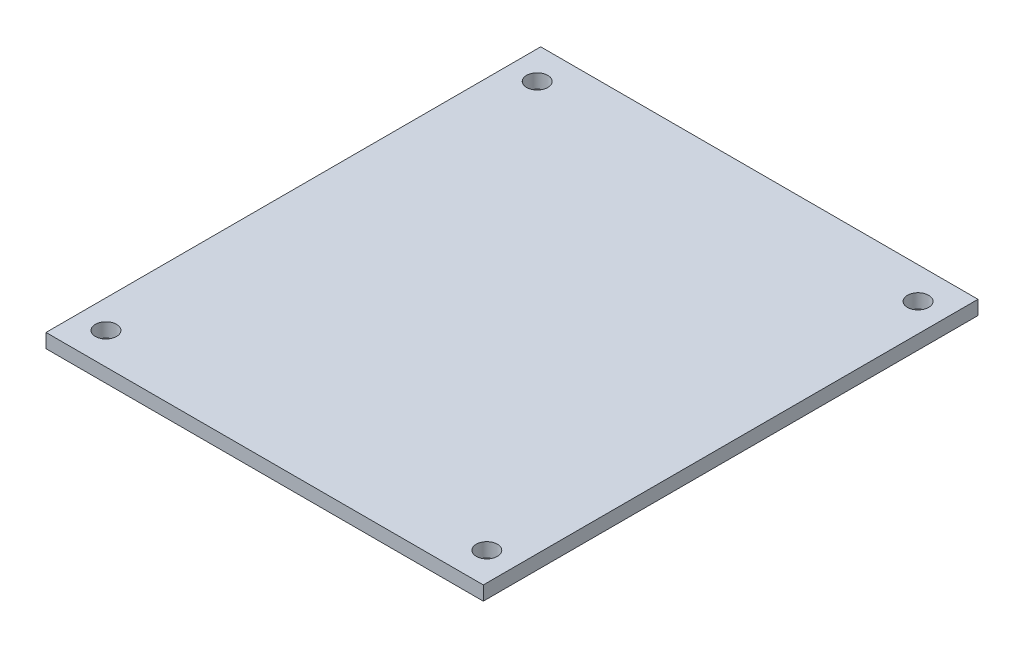
ISO-10303-21;
HEADER;
FILE_DESCRIPTION(('STEP AP214'),'2;1');
FILE_NAME('part.step','',(''),(''),'','','');
FILE_SCHEMA(('AUTOMOTIVE_DESIGN { 1 0 10303 214 1 1 1 1 }'));
ENDSEC;
DATA;
#1=APPLICATION_CONTEXT('core data for automotive mechanical design processes');
#2=APPLICATION_PROTOCOL_DEFINITION('international standard','automotive_design',2000,#1);
#3=PRODUCT_CONTEXT('',#1,'mechanical');
#4=PRODUCT('Part','Part','',(#3));
#5=PRODUCT_RELATED_PRODUCT_CATEGORY('part','',(#4));
#6=PRODUCT_DEFINITION_FORMATION('','',#4);
#7=PRODUCT_DEFINITION_CONTEXT('part definition',#1,'design');
#8=PRODUCT_DEFINITION('design','',#6,#7);
#9=PRODUCT_DEFINITION_SHAPE('','',#8);
#10=(LENGTH_UNIT() NAMED_UNIT(*) SI_UNIT(.MILLI.,.METRE.));
#11=(NAMED_UNIT(*) PLANE_ANGLE_UNIT() SI_UNIT($,.RADIAN.));
#12=(NAMED_UNIT(*) SI_UNIT($,.STERADIAN.) SOLID_ANGLE_UNIT());
#13=UNCERTAINTY_MEASURE_WITH_UNIT(LENGTH_MEASURE(1.E-05),#10,'distance_accuracy_value','');
#14=(GEOMETRIC_REPRESENTATION_CONTEXT(3) GLOBAL_UNCERTAINTY_ASSIGNED_CONTEXT((#13)) GLOBAL_UNIT_ASSIGNED_CONTEXT((#10,
#11,#12)) REPRESENTATION_CONTEXT('',''));
#15=CARTESIAN_POINT('',(0.,0.,0.));
#16=DIRECTION('',(0.,0.,1.));
#17=DIRECTION('',(1.,0.,0.));
#18=AXIS2_PLACEMENT_3D('',#15,#16,#17);
#19=CARTESIAN_POINT('',(0.,2.,0.));
#20=DIRECTION('',(0.,1.,0.));
#21=DIRECTION('',(0.,0.,1.));
#22=AXIS2_PLACEMENT_3D('',#19,#20,#21);
#23=PLANE('',#22);
#24=CARTESIAN_POINT('',(31.6545501334024,2.,17.8504431245316));
#25=DIRECTION('',(0.,1.,0.));
#26=DIRECTION('',(0.,0.,1.));
#27=AXIS2_PLACEMENT_3D('',#24,#25,#26);
#28=CIRCLE('',#27,1.5);
#29=CARTESIAN_POINT('',(31.6545501334024,2.,19.3504431245316));
#30=VERTEX_POINT('',#29);
#31=EDGE_CURVE('E123',#30,#30,#28,.T.);
#32=ORIENTED_EDGE('',*,*,#31,.F.);
#33=EDGE_LOOP('',(#32));
#34=FACE_BOUND('',#33,.T.);
#35=CARTESIAN_POINT('',(-22.3454498665976,2.,-43.2895568754684));
#36=DIRECTION('',(0.,1.,0.));
#37=DIRECTION('',(0.,0.,1.));
#38=AXIS2_PLACEMENT_3D('',#35,#36,#37);
#39=CIRCLE('',#38,1.5);
#40=CARTESIAN_POINT('',(-22.3454498665976,2.,-41.7895568754684));
#41=VERTEX_POINT('',#40);
#42=EDGE_CURVE('E102',#41,#41,#39,.T.);
#43=ORIENTED_EDGE('',*,*,#42,.F.);
#44=EDGE_LOOP('',(#43));
#45=FACE_BOUND('',#44,.T.);
#46=DIRECTION('',(0.,0.,1.));
#47=VECTOR('',#46,1.);
#48=CARTESIAN_POINT('',(-26.3454498665976,2.,-47.7895568754684));
#49=LINE('',#48,#47);
#50=CARTESIAN_POINT('',(-26.3454498665976,2.,-47.7895568754684));
#51=VERTEX_POINT('',#50);
#52=CARTESIAN_POINT('',(-26.3454498665976,2.,22.3504431245316));
#53=VERTEX_POINT('',#52);
#54=EDGE_CURVE('E87',#51,#53,#49,.T.);
#55=ORIENTED_EDGE('',*,*,#54,.T.);
#56=DIRECTION('',(1.,0.,0.));
#57=VECTOR('',#56,1.);
#58=CARTESIAN_POINT('',(-26.3454498665976,2.,22.3504431245316));
#59=LINE('',#58,#57);
#60=CARTESIAN_POINT('',(35.6545501334024,2.,22.3504431245316));
#61=VERTEX_POINT('',#60);
#62=EDGE_CURVE('E82',#53,#61,#59,.T.);
#63=ORIENTED_EDGE('',*,*,#62,.T.);
#64=DIRECTION('',(0.,0.,-1.));
#65=VECTOR('',#64,1.);
#66=CARTESIAN_POINT('',(35.6545501334024,2.,-47.7895568754684));
#67=LINE('',#66,#65);
#68=CARTESIAN_POINT('',(35.6545501334024,2.,-47.7895568754684));
#69=VERTEX_POINT('',#68);
#70=EDGE_CURVE('E85',#61,#69,#67,.T.);
#71=ORIENTED_EDGE('',*,*,#70,.T.);
#72=DIRECTION('',(-1.,0.,0.));
#73=VECTOR('',#72,1.);
#74=CARTESIAN_POINT('',(-26.3454498665976,2.,-47.7895568754684));
#75=LINE('',#74,#73);
#76=EDGE_CURVE('E52',#69,#51,#75,.T.);
#77=ORIENTED_EDGE('',*,*,#76,.T.);
#78=EDGE_LOOP('',(#55,#63,#71,#77));
#79=FACE_BOUND('',#78,.T.);
#80=CARTESIAN_POINT('',(31.6545501334024,2.,-43.2895568754684));
#81=DIRECTION('',(0.,1.,0.));
#82=DIRECTION('',(0.,0.,-1.));
#83=AXIS2_PLACEMENT_3D('',#80,#81,#82);
#84=CIRCLE('',#83,1.5);
#85=CARTESIAN_POINT('',(31.6545501334024,2.,-44.7895568754684));
#86=VERTEX_POINT('',#85);
#87=EDGE_CURVE('E117',#86,#86,#84,.T.);
#88=ORIENTED_EDGE('',*,*,#87,.F.);
#89=EDGE_LOOP('',(#88));
#90=FACE_BOUND('',#89,.T.);
#91=CARTESIAN_POINT('',(-22.3454498665976,2.,17.8504431245316));
#92=DIRECTION('',(0.,1.,0.));
#93=DIRECTION('',(0.,0.,-1.));
#94=AXIS2_PLACEMENT_3D('',#91,#92,#93);
#95=CIRCLE('',#94,1.5);
#96=CARTESIAN_POINT('',(-22.3454498665976,2.,16.3504431245316));
#97=VERTEX_POINT('',#96);
#98=EDGE_CURVE('E129',#97,#97,#95,.T.);
#99=ORIENTED_EDGE('',*,*,#98,.F.);
#100=EDGE_LOOP('',(#99));
#101=FACE_BOUND('',#100,.T.);
#102=ADVANCED_FACE('F35',(#34,#45,#79,#90,#101),#23,.T.);
#103=CARTESIAN_POINT('',(0.,0.,0.));
#104=DIRECTION('',(0.,1.,0.));
#105=DIRECTION('',(0.,0.,1.));
#106=AXIS2_PLACEMENT_3D('',#103,#104,#105);
#107=PLANE('',#106);
#108=DIRECTION('',(0.,0.,1.));
#109=VECTOR('',#108,1.);
#110=CARTESIAN_POINT('',(-26.3454498665976,0.,-47.7895568754684));
#111=LINE('',#110,#109);
#112=CARTESIAN_POINT('',(-26.3454498665976,0.,-47.7895568754684));
#113=VERTEX_POINT('',#112);
#114=CARTESIAN_POINT('',(-26.3454498665976,0.,22.3504431245316));
#115=VERTEX_POINT('',#114);
#116=EDGE_CURVE('E99',#113,#115,#111,.T.);
#117=ORIENTED_EDGE('',*,*,#116,.F.);
#118=DIRECTION('',(-1.,0.,0.));
#119=VECTOR('',#118,1.);
#120=CARTESIAN_POINT('',(-26.3454498665976,0.,-47.7895568754684));
#121=LINE('',#120,#119);
#122=CARTESIAN_POINT('',(35.6545501334024,0.,-47.7895568754684));
#123=VERTEX_POINT('',#122);
#124=EDGE_CURVE('E75',#123,#113,#121,.T.);
#125=ORIENTED_EDGE('',*,*,#124,.F.);
#126=DIRECTION('',(0.,0.,-1.));
#127=VECTOR('',#126,1.);
#128=CARTESIAN_POINT('',(35.6545501334024,0.,-47.7895568754684));
#129=LINE('',#128,#127);
#130=CARTESIAN_POINT('',(35.6545501334024,0.,22.3504431245316));
#131=VERTEX_POINT('',#130);
#132=EDGE_CURVE('E69',#131,#123,#129,.T.);
#133=ORIENTED_EDGE('',*,*,#132,.F.);
#134=DIRECTION('',(1.,0.,0.));
#135=VECTOR('',#134,1.);
#136=CARTESIAN_POINT('',(-26.3454498665976,0.,22.3504431245316));
#137=LINE('',#136,#135);
#138=EDGE_CURVE('E91',#115,#131,#137,.T.);
#139=ORIENTED_EDGE('',*,*,#138,.F.);
#140=EDGE_LOOP('',(#117,#125,#133,#139));
#141=FACE_BOUND('',#140,.T.);
#142=CARTESIAN_POINT('',(-22.3454498665976,0.,-43.2895568754684));
#143=DIRECTION('',(0.,1.,0.));
#144=DIRECTION('',(0.,0.,1.));
#145=AXIS2_PLACEMENT_3D('',#142,#143,#144);
#146=CIRCLE('',#145,1.5);
#147=CARTESIAN_POINT('',(-22.3454498665976,0.,-41.7895568754684));
#148=VERTEX_POINT('',#147);
#149=EDGE_CURVE('E114',#148,#148,#146,.T.);
#150=ORIENTED_EDGE('',*,*,#149,.T.);
#151=EDGE_LOOP('',(#150));
#152=FACE_BOUND('',#151,.T.);
#153=CARTESIAN_POINT('',(31.6545501334024,0.,-43.2895568754684));
#154=DIRECTION('',(0.,1.,0.));
#155=DIRECTION('',(0.,0.,-1.));
#156=AXIS2_PLACEMENT_3D('',#153,#154,#155);
#157=CIRCLE('',#156,1.5);
#158=CARTESIAN_POINT('',(31.6545501334024,0.,-44.7895568754684));
#159=VERTEX_POINT('',#158);
#160=EDGE_CURVE('E120',#159,#159,#157,.T.);
#161=ORIENTED_EDGE('',*,*,#160,.T.);
#162=EDGE_LOOP('',(#161));
#163=FACE_BOUND('',#162,.T.);
#164=CARTESIAN_POINT('',(31.6545501334024,0.,17.8504431245316));
#165=DIRECTION('',(0.,1.,0.));
#166=DIRECTION('',(0.,0.,1.));
#167=AXIS2_PLACEMENT_3D('',#164,#165,#166);
#168=CIRCLE('',#167,1.5);
#169=CARTESIAN_POINT('',(31.6545501334024,0.,19.3504431245316));
#170=VERTEX_POINT('',#169);
#171=EDGE_CURVE('E126',#170,#170,#168,.T.);
#172=ORIENTED_EDGE('',*,*,#171,.T.);
#173=EDGE_LOOP('',(#172));
#174=FACE_BOUND('',#173,.T.);
#175=CARTESIAN_POINT('',(-22.3454498665976,0.,17.8504431245316));
#176=DIRECTION('',(0.,1.,0.));
#177=DIRECTION('',(0.,0.,-1.));
#178=AXIS2_PLACEMENT_3D('',#175,#176,#177);
#179=CIRCLE('',#178,1.5);
#180=CARTESIAN_POINT('',(-22.3454498665976,0.,16.3504431245316));
#181=VERTEX_POINT('',#180);
#182=EDGE_CURVE('E132',#181,#181,#179,.T.);
#183=ORIENTED_EDGE('',*,*,#182,.T.);
#184=EDGE_LOOP('',(#183));
#185=FACE_BOUND('',#184,.T.);
#186=ADVANCED_FACE('F110',(#141,#152,#163,#174,#185),#107,.F.);
#187=CARTESIAN_POINT('',(-26.3454498665976,2.,-47.7895568754684));
#188=DIRECTION('',(1.,0.,0.));
#189=DIRECTION('',(0.,0.,-1.));
#190=AXIS2_PLACEMENT_3D('',#187,#188,#189);
#191=PLANE('',#190);
#192=ORIENTED_EDGE('',*,*,#116,.T.);
#193=DIRECTION('',(0.,-1.,0.));
#194=VECTOR('',#193,1.);
#195=CARTESIAN_POINT('',(-26.3454498665976,2.,22.3504431245316));
#196=LINE('',#195,#194);
#197=EDGE_CURVE('E11',#53,#115,#196,.T.);
#198=ORIENTED_EDGE('',*,*,#197,.F.);
#199=ORIENTED_EDGE('',*,*,#54,.F.);
#200=DIRECTION('',(0.,-1.,0.));
#201=VECTOR('',#200,1.);
#202=CARTESIAN_POINT('',(-26.3454498665976,2.,-47.7895568754684));
#203=LINE('',#202,#201);
#204=EDGE_CURVE('E95',#51,#113,#203,.T.);
#205=ORIENTED_EDGE('',*,*,#204,.T.);
#206=EDGE_LOOP('',(#192,#198,#199,#205));
#207=FACE_BOUND('',#206,.T.);
#208=ADVANCED_FACE('F37',(#207),#191,.F.);
#209=CARTESIAN_POINT('',(-26.3454498665976,2.,22.3504431245316));
#210=DIRECTION('',(0.,0.,-1.));
#211=DIRECTION('',(-1.,0.,0.));
#212=AXIS2_PLACEMENT_3D('',#209,#210,#211);
#213=PLANE('',#212);
#214=ORIENTED_EDGE('',*,*,#138,.T.);
#215=DIRECTION('',(0.,-1.,0.));
#216=VECTOR('',#215,1.);
#217=CARTESIAN_POINT('',(35.6545501334024,2.,22.3504431245316));
#218=LINE('',#217,#216);
#219=EDGE_CURVE('E44',#61,#131,#218,.T.);
#220=ORIENTED_EDGE('',*,*,#219,.F.);
#221=ORIENTED_EDGE('',*,*,#62,.F.);
#222=ORIENTED_EDGE('',*,*,#197,.T.);
#223=EDGE_LOOP('',(#214,#220,#221,#222));
#224=FACE_BOUND('',#223,.T.);
#225=ADVANCED_FACE('F90',(#224),#213,.F.);
#226=CARTESIAN_POINT('',(35.6545501334024,2.,-47.7895568754684));
#227=DIRECTION('',(-1.,0.,0.));
#228=DIRECTION('',(0.,0.,1.));
#229=AXIS2_PLACEMENT_3D('',#226,#227,#228);
#230=PLANE('',#229);
#231=ORIENTED_EDGE('',*,*,#132,.T.);
#232=DIRECTION('',(0.,-1.,0.));
#233=VECTOR('',#232,1.);
#234=CARTESIAN_POINT('',(35.6545501334024,2.,-47.7895568754684));
#235=LINE('',#234,#233);
#236=EDGE_CURVE('E92',#69,#123,#235,.T.);
#237=ORIENTED_EDGE('',*,*,#236,.F.);
#238=ORIENTED_EDGE('',*,*,#70,.F.);
#239=ORIENTED_EDGE('',*,*,#219,.T.);
#240=EDGE_LOOP('',(#231,#237,#238,#239));
#241=FACE_BOUND('',#240,.T.);
#242=ADVANCED_FACE('F93',(#241),#230,.F.);
#243=CARTESIAN_POINT('',(-26.3454498665976,2.,-47.7895568754684));
#244=DIRECTION('',(0.,0.,1.));
#245=DIRECTION('',(1.,0.,0.));
#246=AXIS2_PLACEMENT_3D('',#243,#244,#245);
#247=PLANE('',#246);
#248=ORIENTED_EDGE('',*,*,#124,.T.);
#249=ORIENTED_EDGE('',*,*,#204,.F.);
#250=ORIENTED_EDGE('',*,*,#76,.F.);
#251=ORIENTED_EDGE('',*,*,#236,.T.);
#252=EDGE_LOOP('',(#248,#249,#250,#251));
#253=FACE_BOUND('',#252,.T.);
#254=ADVANCED_FACE('F107',(#253),#247,.F.);
#255=CARTESIAN_POINT('',(-22.3454498665976,2.,-43.2895568754684));
#256=DIRECTION('',(0.,-1.,0.));
#257=DIRECTION('',(0.,0.,-1.));
#258=AXIS2_PLACEMENT_3D('',#255,#256,#257);
#259=CYLINDRICAL_SURFACE('',#258,1.5);
#260=ORIENTED_EDGE('',*,*,#42,.T.);
#261=EDGE_LOOP('',(#260));
#262=FACE_BOUND('',#261,.T.);
#263=ORIENTED_EDGE('',*,*,#149,.F.);
#264=EDGE_LOOP('',(#263));
#265=FACE_BOUND('',#264,.T.);
#266=ADVANCED_FACE('F151',(#262,#265),#259,.F.);
#267=CARTESIAN_POINT('',(31.6545501334024,2.,-43.2895568754684));
#268=DIRECTION('',(0.,-1.,0.));
#269=DIRECTION('',(0.,0.,-1.));
#270=AXIS2_PLACEMENT_3D('',#267,#268,#269);
#271=CYLINDRICAL_SURFACE('',#270,1.5);
#272=ORIENTED_EDGE('',*,*,#87,.T.);
#273=EDGE_LOOP('',(#272));
#274=FACE_BOUND('',#273,.T.);
#275=ORIENTED_EDGE('',*,*,#160,.F.);
#276=EDGE_LOOP('',(#275));
#277=FACE_BOUND('',#276,.T.);
#278=ADVANCED_FACE('F197',(#274,#277),#271,.F.);
#279=CARTESIAN_POINT('',(31.6545501334024,2.,17.8504431245316));
#280=DIRECTION('',(0.,-1.,0.));
#281=DIRECTION('',(0.,0.,-1.));
#282=AXIS2_PLACEMENT_3D('',#279,#280,#281);
#283=CYLINDRICAL_SURFACE('',#282,1.5);
#284=ORIENTED_EDGE('',*,*,#31,.T.);
#285=EDGE_LOOP('',(#284));
#286=FACE_BOUND('',#285,.T.);
#287=ORIENTED_EDGE('',*,*,#171,.F.);
#288=EDGE_LOOP('',(#287));
#289=FACE_BOUND('',#288,.T.);
#290=ADVANCED_FACE('F205',(#286,#289),#283,.F.);
#291=CARTESIAN_POINT('',(-22.3454498665976,2.,17.8504431245316));
#292=DIRECTION('',(0.,-1.,0.));
#293=DIRECTION('',(0.,0.,-1.));
#294=AXIS2_PLACEMENT_3D('',#291,#292,#293);
#295=CYLINDRICAL_SURFACE('',#294,1.5);
#296=ORIENTED_EDGE('',*,*,#98,.T.);
#297=EDGE_LOOP('',(#296));
#298=FACE_BOUND('',#297,.T.);
#299=ORIENTED_EDGE('',*,*,#182,.F.);
#300=EDGE_LOOP('',(#299));
#301=FACE_BOUND('',#300,.T.);
#302=ADVANCED_FACE('F138',(#298,#301),#295,.F.);
#303=CLOSED_SHELL('',(#102,#186,#208,#225,#242,#254,#266,#278,#290,#302));
#304=MANIFOLD_SOLID_BREP('B2',#303);
#305=ADVANCED_BREP_SHAPE_REPRESENTATION('',(#18,#304),#14);
#306=SHAPE_DEFINITION_REPRESENTATION(#9,#305);
ENDSEC;
END-ISO-10303-21;
